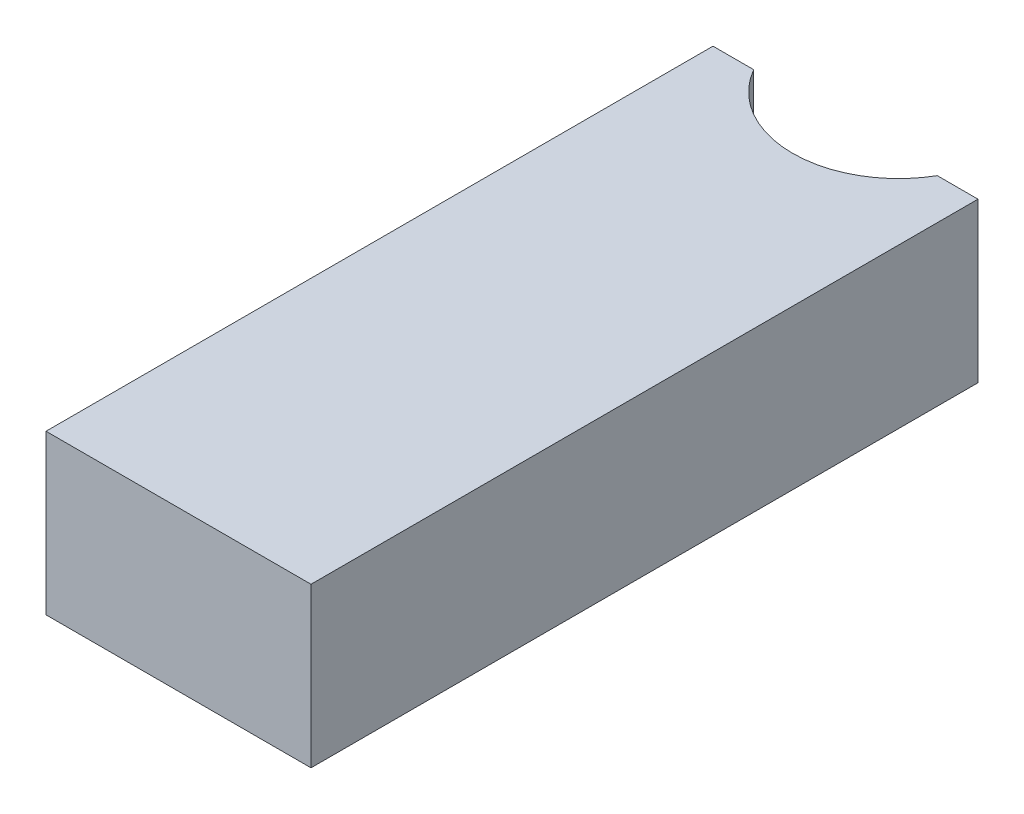
ISO-10303-21;
HEADER;
FILE_DESCRIPTION(('STEP AP214'),'2;1');
FILE_NAME('part.step','',(''),(''),'','','');
FILE_SCHEMA(('AUTOMOTIVE_DESIGN { 1 0 10303 214 1 1 1 1 }'));
ENDSEC;
DATA;
#1=APPLICATION_CONTEXT('core data for automotive mechanical design processes');
#2=APPLICATION_PROTOCOL_DEFINITION('international standard','automotive_design',2000,#1);
#3=PRODUCT_CONTEXT('',#1,'mechanical');
#4=PRODUCT('Part','Part','',(#3));
#5=PRODUCT_RELATED_PRODUCT_CATEGORY('part','',(#4));
#6=PRODUCT_DEFINITION_FORMATION('','',#4);
#7=PRODUCT_DEFINITION_CONTEXT('part definition',#1,'design');
#8=PRODUCT_DEFINITION('design','',#6,#7);
#9=PRODUCT_DEFINITION_SHAPE('','',#8);
#10=(LENGTH_UNIT() NAMED_UNIT(*) SI_UNIT(.MILLI.,.METRE.));
#11=(NAMED_UNIT(*) PLANE_ANGLE_UNIT() SI_UNIT($,.RADIAN.));
#12=(NAMED_UNIT(*) SI_UNIT($,.STERADIAN.) SOLID_ANGLE_UNIT());
#13=UNCERTAINTY_MEASURE_WITH_UNIT(LENGTH_MEASURE(1.E-05),#10,'distance_accuracy_value','');
#14=(GEOMETRIC_REPRESENTATION_CONTEXT(3) GLOBAL_UNCERTAINTY_ASSIGNED_CONTEXT((#13)) GLOBAL_UNIT_ASSIGNED_CONTEXT((#10,
#11,#12)) REPRESENTATION_CONTEXT('',''));
#15=CARTESIAN_POINT('',(0.,0.,0.));
#16=DIRECTION('',(0.,0.,1.));
#17=DIRECTION('',(1.,0.,0.));
#18=AXIS2_PLACEMENT_3D('',#15,#16,#17);
#19=CARTESIAN_POINT('',(0.,0.,0.));
#20=DIRECTION('',(0.,0.,1.));
#21=DIRECTION('',(1.,0.,0.));
#22=AXIS2_PLACEMENT_3D('',#19,#20,#21);
#23=PLANE('',#22);
#24=DIRECTION('',(1.,0.,0.));
#25=VECTOR('',#24,1.);
#26=CARTESIAN_POINT('',(-15.875,-9.525,0.));
#27=LINE('',#26,#25);
#28=CARTESIAN_POINT('',(10.9985226280624,-9.525,0.));
#29=VERTEX_POINT('',#28);
#30=CARTESIAN_POINT('',(15.875,-9.525,0.));
#31=VERTEX_POINT('',#30);
#32=EDGE_CURVE('E90',#29,#31,#27,.T.);
#33=ORIENTED_EDGE('',*,*,#32,.F.);
#34=DIRECTION('',(0.,1.,0.));
#35=VECTOR('',#34,1.);
#36=CARTESIAN_POINT('',(10.9985226280624,-9.525,0.));
#37=LINE('',#36,#35);
#38=CARTESIAN_POINT('',(10.9985226280624,9.525,0.));
#39=VERTEX_POINT('',#38);
#40=EDGE_CURVE('E11',#29,#39,#37,.T.);
#41=ORIENTED_EDGE('',*,*,#40,.T.);
#42=DIRECTION('',(-1.,0.,0.));
#43=VECTOR('',#42,1.);
#44=CARTESIAN_POINT('',(-15.875,9.525,0.));
#45=LINE('',#44,#43);
#46=CARTESIAN_POINT('',(15.875,9.525,0.));
#47=VERTEX_POINT('',#46);
#48=EDGE_CURVE('E114',#47,#39,#45,.T.);
#49=ORIENTED_EDGE('',*,*,#48,.F.);
#50=DIRECTION('',(0.,1.,0.));
#51=VECTOR('',#50,1.);
#52=CARTESIAN_POINT('',(15.875,9.525,0.));
#53=LINE('',#52,#51);
#54=EDGE_CURVE('E126',#31,#47,#53,.T.);
#55=ORIENTED_EDGE('',*,*,#54,.F.);
#56=EDGE_LOOP('',(#33,#41,#49,#55));
#57=FACE_BOUND('',#56,.T.);
#58=ADVANCED_FACE('F45',(#57),#23,.F.);
#59=CARTESIAN_POINT('',(15.875,9.525,79.9084));
#60=DIRECTION('',(-1.,0.,0.));
#61=DIRECTION('',(0.,0.,1.));
#62=AXIS2_PLACEMENT_3D('',#59,#60,#61);
#63=PLANE('',#62);
#64=ORIENTED_EDGE('',*,*,#54,.T.);
#65=DIRECTION('',(0.,0.,-1.));
#66=VECTOR('',#65,1.);
#67=CARTESIAN_POINT('',(15.875,9.525,79.9084));
#68=LINE('',#67,#66);
#69=CARTESIAN_POINT('',(15.875,9.525,79.9084));
#70=VERTEX_POINT('',#69);
#71=EDGE_CURVE('E117',#70,#47,#68,.T.);
#72=ORIENTED_EDGE('',*,*,#71,.F.);
#73=DIRECTION('',(0.,1.,0.));
#74=VECTOR('',#73,1.);
#75=CARTESIAN_POINT('',(15.875,9.525,79.9084));
#76=LINE('',#75,#74);
#77=CARTESIAN_POINT('',(15.875,-9.525,79.9084));
#78=VERTEX_POINT('',#77);
#79=EDGE_CURVE('E134',#78,#70,#76,.T.);
#80=ORIENTED_EDGE('',*,*,#79,.F.);
#81=DIRECTION('',(0.,0.,-1.));
#82=VECTOR('',#81,1.);
#83=CARTESIAN_POINT('',(15.875,-9.525,79.9084));
#84=LINE('',#83,#82);
#85=EDGE_CURVE('E135',#78,#31,#84,.T.);
#86=ORIENTED_EDGE('',*,*,#85,.T.);
#87=EDGE_LOOP('',(#64,#72,#80,#86));
#88=FACE_BOUND('',#87,.T.);
#89=ADVANCED_FACE('F47',(#88),#63,.F.);
#90=CARTESIAN_POINT('',(-15.875,9.525,79.9084));
#91=DIRECTION('',(0.,-1.,0.));
#92=DIRECTION('',(0.,0.,-1.));
#93=AXIS2_PLACEMENT_3D('',#90,#91,#92);
#94=PLANE('',#93);
#95=ORIENTED_EDGE('',*,*,#48,.T.);
#96=CARTESIAN_POINT('',(0.,9.525,-6.35));
#97=DIRECTION('',(0.,1.,0.));
#98=DIRECTION('',(0.,0.,1.));
#99=AXIS2_PLACEMENT_3D('',#96,#97,#98);
#100=CIRCLE('',#99,12.7);
#101=CARTESIAN_POINT('',(-10.9985226280624,9.525,0.));
#102=VERTEX_POINT('',#101);
#103=EDGE_CURVE('E106',#102,#39,#100,.T.);
#104=ORIENTED_EDGE('',*,*,#103,.F.);
#105=CARTESIAN_POINT('',(-15.875,9.525,0.));
#106=VERTEX_POINT('',#105);
#107=EDGE_CURVE('E121',#102,#106,#45,.T.);
#108=ORIENTED_EDGE('',*,*,#107,.T.);
#109=DIRECTION('',(0.,0.,-1.));
#110=VECTOR('',#109,1.);
#111=CARTESIAN_POINT('',(-15.875,9.525,79.9084));
#112=LINE('',#111,#110);
#113=CARTESIAN_POINT('',(-15.875,9.525,79.9084));
#114=VERTEX_POINT('',#113);
#115=EDGE_CURVE('E142',#114,#106,#112,.T.);
#116=ORIENTED_EDGE('',*,*,#115,.F.);
#117=DIRECTION('',(-1.,0.,0.));
#118=VECTOR('',#117,1.);
#119=CARTESIAN_POINT('',(-15.875,9.525,79.9084));
#120=LINE('',#119,#118);
#121=EDGE_CURVE('E98',#70,#114,#120,.T.);
#122=ORIENTED_EDGE('',*,*,#121,.F.);
#123=ORIENTED_EDGE('',*,*,#71,.T.);
#124=EDGE_LOOP('',(#95,#104,#108,#116,#122,#123));
#125=FACE_BOUND('',#124,.T.);
#126=ADVANCED_FACE('F115',(#125),#94,.F.);
#127=CARTESIAN_POINT('',(-15.875,9.525,79.9084));
#128=DIRECTION('',(1.,0.,0.));
#129=DIRECTION('',(0.,0.,-1.));
#130=AXIS2_PLACEMENT_3D('',#127,#128,#129);
#131=PLANE('',#130);
#132=DIRECTION('',(0.,-1.,0.));
#133=VECTOR('',#132,1.);
#134=CARTESIAN_POINT('',(-15.875,9.525,0.));
#135=LINE('',#134,#133);
#136=CARTESIAN_POINT('',(-15.875,-9.525,0.));
#137=VERTEX_POINT('',#136);
#138=EDGE_CURVE('E120',#106,#137,#135,.T.);
#139=ORIENTED_EDGE('',*,*,#138,.T.);
#140=DIRECTION('',(0.,0.,-1.));
#141=VECTOR('',#140,1.);
#142=CARTESIAN_POINT('',(-15.875,-9.525,79.9084));
#143=LINE('',#142,#141);
#144=CARTESIAN_POINT('',(-15.875,-9.525,79.9084));
#145=VERTEX_POINT('',#144);
#146=EDGE_CURVE('E138',#145,#137,#143,.T.);
#147=ORIENTED_EDGE('',*,*,#146,.F.);
#148=DIRECTION('',(0.,-1.,0.));
#149=VECTOR('',#148,1.);
#150=CARTESIAN_POINT('',(-15.875,9.525,79.9084));
#151=LINE('',#150,#149);
#152=EDGE_CURVE('E157',#114,#145,#151,.T.);
#153=ORIENTED_EDGE('',*,*,#152,.F.);
#154=ORIENTED_EDGE('',*,*,#115,.T.);
#155=EDGE_LOOP('',(#139,#147,#153,#154));
#156=FACE_BOUND('',#155,.T.);
#157=ADVANCED_FACE('F156',(#156),#131,.F.);
#158=CARTESIAN_POINT('',(-15.875,-9.525,79.9084));
#159=DIRECTION('',(0.,1.,0.));
#160=DIRECTION('',(0.,0.,1.));
#161=AXIS2_PLACEMENT_3D('',#158,#159,#160);
#162=PLANE('',#161);
#163=CARTESIAN_POINT('',(-10.9985226280624,-9.525,0.));
#164=VERTEX_POINT('',#163);
#165=EDGE_CURVE('E130',#137,#164,#27,.T.);
#166=ORIENTED_EDGE('',*,*,#165,.T.);
#167=CARTESIAN_POINT('',(0.,-9.525,-6.35));
#168=DIRECTION('',(0.,1.,0.));
#169=DIRECTION('',(0.,0.,1.));
#170=AXIS2_PLACEMENT_3D('',#167,#168,#169);
#171=CIRCLE('',#170,12.7);
#172=EDGE_CURVE('E61',#164,#29,#171,.T.);
#173=ORIENTED_EDGE('',*,*,#172,.T.);
#174=ORIENTED_EDGE('',*,*,#32,.T.);
#175=ORIENTED_EDGE('',*,*,#85,.F.);
#176=DIRECTION('',(1.,0.,0.));
#177=VECTOR('',#176,1.);
#178=CARTESIAN_POINT('',(-15.875,-9.525,79.9084));
#179=LINE('',#178,#177);
#180=EDGE_CURVE('E70',#145,#78,#179,.T.);
#181=ORIENTED_EDGE('',*,*,#180,.F.);
#182=ORIENTED_EDGE('',*,*,#146,.T.);
#183=EDGE_LOOP('',(#166,#173,#174,#175,#181,#182));
#184=FACE_BOUND('',#183,.T.);
#185=ADVANCED_FACE('F152',(#184),#162,.F.);
#186=CARTESIAN_POINT('',(0.,0.,79.9084));
#187=DIRECTION('',(0.,0.,1.));
#188=DIRECTION('',(1.,0.,0.));
#189=AXIS2_PLACEMENT_3D('',#186,#187,#188);
#190=PLANE('',#189);
#191=ORIENTED_EDGE('',*,*,#79,.T.);
#192=ORIENTED_EDGE('',*,*,#121,.T.);
#193=ORIENTED_EDGE('',*,*,#152,.T.);
#194=ORIENTED_EDGE('',*,*,#180,.T.);
#195=EDGE_LOOP('',(#191,#192,#193,#194));
#196=FACE_BOUND('',#195,.T.);
#197=ADVANCED_FACE('F170',(#196),#190,.T.);
#198=ORIENTED_EDGE('',*,*,#107,.F.);
#199=DIRECTION('',(0.,1.,0.));
#200=VECTOR('',#199,1.);
#201=CARTESIAN_POINT('',(-10.9985226280624,-9.525,0.));
#202=LINE('',#201,#200);
#203=EDGE_CURVE('E54',#102,#164,#202,.F.);
#204=ORIENTED_EDGE('',*,*,#203,.T.);
#205=ORIENTED_EDGE('',*,*,#165,.F.);
#206=ORIENTED_EDGE('',*,*,#138,.F.);
#207=EDGE_LOOP('',(#198,#204,#205,#206));
#208=FACE_BOUND('',#207,.T.);
#209=ADVANCED_FACE('F150',(#208),#23,.F.);
#210=CARTESIAN_POINT('',(0.,-9.525,-6.35));
#211=DIRECTION('',(0.,1.,0.));
#212=DIRECTION('',(0.,0.,1.));
#213=AXIS2_PLACEMENT_3D('',#210,#211,#212);
#214=CYLINDRICAL_SURFACE('',#213,12.7);
#215=ORIENTED_EDGE('',*,*,#172,.F.);
#216=ORIENTED_EDGE('',*,*,#203,.F.);
#217=ORIENTED_EDGE('',*,*,#103,.T.);
#218=ORIENTED_EDGE('',*,*,#40,.F.);
#219=EDGE_LOOP('',(#215,#216,#217,#218));
#220=FACE_BOUND('',#219,.T.);
#221=ADVANCED_FACE('F107',(#220),#214,.F.);
#222=CLOSED_SHELL('',(#58,#89,#126,#157,#185,#197,#209,#221));
#223=MANIFOLD_SOLID_BREP('B2',#222);
#224=ADVANCED_BREP_SHAPE_REPRESENTATION('',(#18,#223),#14);
#225=SHAPE_DEFINITION_REPRESENTATION(#9,#224);
ENDSEC;
END-ISO-10303-21;
